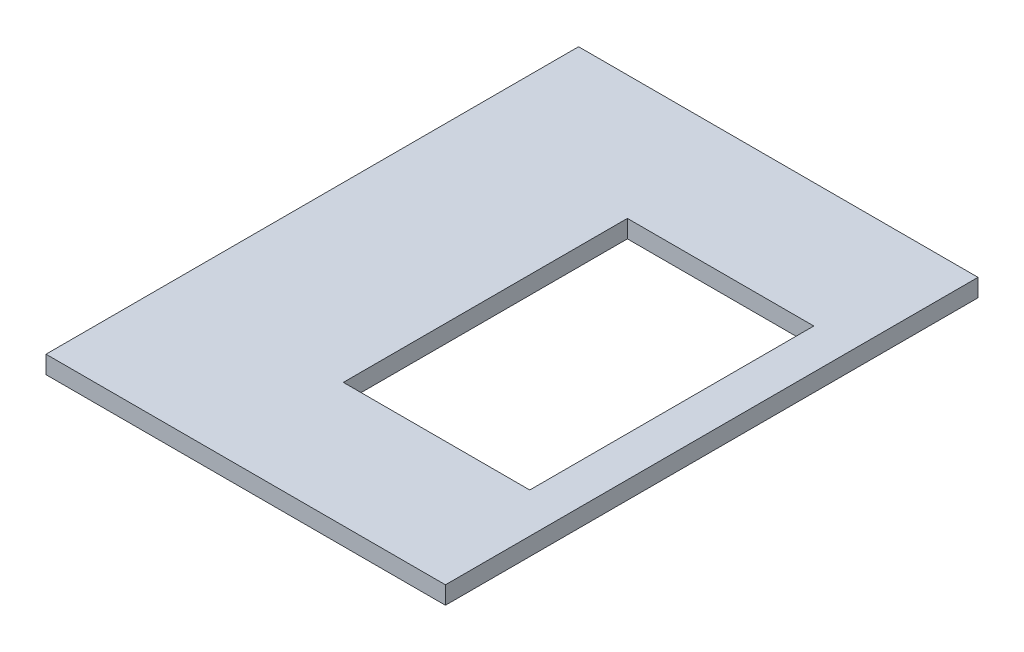
ISO-10303-21;
HEADER;
FILE_DESCRIPTION(('STEP AP214'),'2;1');
FILE_NAME('part.step','',(''),(''),'','','');
FILE_SCHEMA(('AUTOMOTIVE_DESIGN { 1 0 10303 214 1 1 1 1 }'));
ENDSEC;
DATA;
#1=APPLICATION_CONTEXT('core data for automotive mechanical design processes');
#2=APPLICATION_PROTOCOL_DEFINITION('international standard','automotive_design',2000,#1);
#3=PRODUCT_CONTEXT('',#1,'mechanical');
#4=PRODUCT('Part','Part','',(#3));
#5=PRODUCT_RELATED_PRODUCT_CATEGORY('part','',(#4));
#6=PRODUCT_DEFINITION_FORMATION('','',#4);
#7=PRODUCT_DEFINITION_CONTEXT('part definition',#1,'design');
#8=PRODUCT_DEFINITION('design','',#6,#7);
#9=PRODUCT_DEFINITION_SHAPE('','',#8);
#10=(LENGTH_UNIT() NAMED_UNIT(*) SI_UNIT(.MILLI.,.METRE.));
#11=(NAMED_UNIT(*) PLANE_ANGLE_UNIT() SI_UNIT($,.RADIAN.));
#12=(NAMED_UNIT(*) SI_UNIT($,.STERADIAN.) SOLID_ANGLE_UNIT());
#13=UNCERTAINTY_MEASURE_WITH_UNIT(LENGTH_MEASURE(1.E-05),#10,'distance_accuracy_value','');
#14=(GEOMETRIC_REPRESENTATION_CONTEXT(3) GLOBAL_UNCERTAINTY_ASSIGNED_CONTEXT((#13)) GLOBAL_UNIT_ASSIGNED_CONTEXT((#10,
#11,#12)) REPRESENTATION_CONTEXT('',''));
#15=CARTESIAN_POINT('',(0.,0.,0.));
#16=DIRECTION('',(0.,0.,1.));
#17=DIRECTION('',(1.,0.,0.));
#18=AXIS2_PLACEMENT_3D('',#15,#16,#17);
#19=CARTESIAN_POINT('',(22.5,2.,30.));
#20=DIRECTION('',(-1.,0.,0.));
#21=DIRECTION('',(0.,0.,1.));
#22=AXIS2_PLACEMENT_3D('',#19,#20,#21);
#23=PLANE('',#22);
#24=DIRECTION('',(0.,0.,-1.));
#25=VECTOR('',#24,1.);
#26=CARTESIAN_POINT('',(22.5,0.,30.));
#27=LINE('',#26,#25);
#28=CARTESIAN_POINT('',(22.5,0.,30.));
#29=VERTEX_POINT('',#28);
#30=CARTESIAN_POINT('',(22.5,0.,-30.));
#31=VERTEX_POINT('',#30);
#32=EDGE_CURVE('E130',#29,#31,#27,.T.);
#33=ORIENTED_EDGE('',*,*,#32,.T.);
#34=DIRECTION('',(0.,-1.,0.));
#35=VECTOR('',#34,1.);
#36=CARTESIAN_POINT('',(22.5,2.,-30.));
#37=LINE('',#36,#35);
#38=CARTESIAN_POINT('',(22.5,2.,-30.));
#39=VERTEX_POINT('',#38);
#40=EDGE_CURVE('E11',#39,#31,#37,.T.);
#41=ORIENTED_EDGE('',*,*,#40,.F.);
#42=DIRECTION('',(0.,0.,-1.));
#43=VECTOR('',#42,1.);
#44=CARTESIAN_POINT('',(22.5,2.,30.));
#45=LINE('',#44,#43);
#46=CARTESIAN_POINT('',(22.5,2.,30.));
#47=VERTEX_POINT('',#46);
#48=EDGE_CURVE('E134',#47,#39,#45,.T.);
#49=ORIENTED_EDGE('',*,*,#48,.F.);
#50=DIRECTION('',(0.,-1.,0.));
#51=VECTOR('',#50,1.);
#52=CARTESIAN_POINT('',(22.5,2.,30.));
#53=LINE('',#52,#51);
#54=EDGE_CURVE('E144',#47,#29,#53,.T.);
#55=ORIENTED_EDGE('',*,*,#54,.T.);
#56=EDGE_LOOP('',(#33,#41,#49,#55));
#57=FACE_BOUND('',#56,.T.);
#58=ADVANCED_FACE('F33',(#57),#23,.F.);
#59=CARTESIAN_POINT('',(-22.5,2.,-30.));
#60=DIRECTION('',(0.,0.,1.));
#61=DIRECTION('',(1.,0.,0.));
#62=AXIS2_PLACEMENT_3D('',#59,#60,#61);
#63=PLANE('',#62);
#64=DIRECTION('',(-1.,0.,0.));
#65=VECTOR('',#64,1.);
#66=CARTESIAN_POINT('',(-22.5,0.,-30.));
#67=LINE('',#66,#65);
#68=CARTESIAN_POINT('',(-22.5,0.,-30.));
#69=VERTEX_POINT('',#68);
#70=EDGE_CURVE('E147',#31,#69,#67,.T.);
#71=ORIENTED_EDGE('',*,*,#70,.T.);
#72=DIRECTION('',(0.,-1.,0.));
#73=VECTOR('',#72,1.);
#74=CARTESIAN_POINT('',(-22.5,2.,-30.));
#75=LINE('',#74,#73);
#76=CARTESIAN_POINT('',(-22.5,2.,-30.));
#77=VERTEX_POINT('',#76);
#78=EDGE_CURVE('E40',#77,#69,#75,.T.);
#79=ORIENTED_EDGE('',*,*,#78,.F.);
#80=DIRECTION('',(-1.,0.,0.));
#81=VECTOR('',#80,1.);
#82=CARTESIAN_POINT('',(-22.5,2.,-30.));
#83=LINE('',#82,#81);
#84=EDGE_CURVE('E137',#39,#77,#83,.T.);
#85=ORIENTED_EDGE('',*,*,#84,.F.);
#86=ORIENTED_EDGE('',*,*,#40,.T.);
#87=EDGE_LOOP('',(#71,#79,#85,#86));
#88=FACE_BOUND('',#87,.T.);
#89=ADVANCED_FACE('F175',(#88),#63,.F.);
#90=CARTESIAN_POINT('',(-22.5,2.,30.));
#91=DIRECTION('',(1.,0.,0.));
#92=DIRECTION('',(0.,0.,-1.));
#93=AXIS2_PLACEMENT_3D('',#90,#91,#92);
#94=PLANE('',#93);
#95=DIRECTION('',(0.,0.,1.));
#96=VECTOR('',#95,1.);
#97=CARTESIAN_POINT('',(-22.5,0.,30.));
#98=LINE('',#97,#96);
#99=CARTESIAN_POINT('',(-22.5,0.,30.));
#100=VERTEX_POINT('',#99);
#101=EDGE_CURVE('E149',#69,#100,#98,.T.);
#102=ORIENTED_EDGE('',*,*,#101,.T.);
#103=DIRECTION('',(0.,-1.,0.));
#104=VECTOR('',#103,1.);
#105=CARTESIAN_POINT('',(-22.5,2.,30.));
#106=LINE('',#105,#104);
#107=CARTESIAN_POINT('',(-22.5,2.,30.));
#108=VERTEX_POINT('',#107);
#109=EDGE_CURVE('E154',#108,#100,#106,.T.);
#110=ORIENTED_EDGE('',*,*,#109,.F.);
#111=DIRECTION('',(0.,0.,1.));
#112=VECTOR('',#111,1.);
#113=CARTESIAN_POINT('',(-22.5,2.,30.));
#114=LINE('',#113,#112);
#115=EDGE_CURVE('E140',#77,#108,#114,.T.);
#116=ORIENTED_EDGE('',*,*,#115,.F.);
#117=ORIENTED_EDGE('',*,*,#78,.T.);
#118=EDGE_LOOP('',(#102,#110,#116,#117));
#119=FACE_BOUND('',#118,.T.);
#120=ADVANCED_FACE('F161',(#119),#94,.F.);
#121=CARTESIAN_POINT('',(-22.5,2.,30.));
#122=DIRECTION('',(0.,0.,-1.));
#123=DIRECTION('',(-1.,0.,0.));
#124=AXIS2_PLACEMENT_3D('',#121,#122,#123);
#125=PLANE('',#124);
#126=DIRECTION('',(1.,0.,0.));
#127=VECTOR('',#126,1.);
#128=CARTESIAN_POINT('',(-22.5,0.,30.));
#129=LINE('',#128,#127);
#130=EDGE_CURVE('E138',#100,#29,#129,.T.);
#131=ORIENTED_EDGE('',*,*,#130,.T.);
#132=ORIENTED_EDGE('',*,*,#54,.F.);
#133=DIRECTION('',(1.,0.,0.));
#134=VECTOR('',#133,1.);
#135=CARTESIAN_POINT('',(-22.5,2.,30.));
#136=LINE('',#135,#134);
#137=EDGE_CURVE('E142',#108,#47,#136,.T.);
#138=ORIENTED_EDGE('',*,*,#137,.F.);
#139=ORIENTED_EDGE('',*,*,#109,.T.);
#140=EDGE_LOOP('',(#131,#132,#138,#139));
#141=FACE_BOUND('',#140,.T.);
#142=ADVANCED_FACE('F168',(#141),#125,.F.);
#143=CARTESIAN_POINT('',(0.,2.,0.));
#144=DIRECTION('',(0.,-1.,0.));
#145=DIRECTION('',(0.,0.,-1.));
#146=AXIS2_PLACEMENT_3D('',#143,#144,#145);
#147=PLANE('',#146);
#148=DIRECTION('',(-1.,0.,0.));
#149=VECTOR('',#148,1.);
#150=CARTESIAN_POINT('',(-3.,2.,-16.));
#151=LINE('',#150,#149);
#152=CARTESIAN_POINT('',(18.,2.,-16.));
#153=VERTEX_POINT('',#152);
#154=CARTESIAN_POINT('',(-3.,2.,-16.));
#155=VERTEX_POINT('',#154);
#156=EDGE_CURVE('E124',#153,#155,#151,.T.);
#157=ORIENTED_EDGE('',*,*,#156,.F.);
#158=DIRECTION('',(0.,0.,-1.));
#159=VECTOR('',#158,1.);
#160=CARTESIAN_POINT('',(18.,2.,-16.));
#161=LINE('',#160,#159);
#162=CARTESIAN_POINT('',(18.,2.,16.));
#163=VERTEX_POINT('',#162);
#164=EDGE_CURVE('E47',#163,#153,#161,.T.);
#165=ORIENTED_EDGE('',*,*,#164,.F.);
#166=DIRECTION('',(1.,0.,0.));
#167=VECTOR('',#166,1.);
#168=CARTESIAN_POINT('',(-3.,2.,16.));
#169=LINE('',#168,#167);
#170=CARTESIAN_POINT('',(-3.,2.,16.));
#171=VERTEX_POINT('',#170);
#172=EDGE_CURVE('E115',#171,#163,#169,.T.);
#173=ORIENTED_EDGE('',*,*,#172,.F.);
#174=DIRECTION('',(0.,0.,1.));
#175=VECTOR('',#174,1.);
#176=CARTESIAN_POINT('',(-3.,2.,-16.));
#177=LINE('',#176,#175);
#178=EDGE_CURVE('E118',#155,#171,#177,.T.);
#179=ORIENTED_EDGE('',*,*,#178,.F.);
#180=EDGE_LOOP('',(#157,#165,#173,#179));
#181=FACE_BOUND('',#180,.T.);
#182=ORIENTED_EDGE('',*,*,#48,.T.);
#183=ORIENTED_EDGE('',*,*,#84,.T.);
#184=ORIENTED_EDGE('',*,*,#115,.T.);
#185=ORIENTED_EDGE('',*,*,#137,.T.);
#186=EDGE_LOOP('',(#182,#183,#184,#185));
#187=FACE_BOUND('',#186,.T.);
#188=ADVANCED_FACE('F174',(#181,#187),#147,.F.);
#189=CARTESIAN_POINT('',(0.,0.,0.));
#190=DIRECTION('',(0.,-1.,0.));
#191=DIRECTION('',(0.,0.,-1.));
#192=AXIS2_PLACEMENT_3D('',#189,#190,#191);
#193=PLANE('',#192);
#194=DIRECTION('',(0.,0.,-1.));
#195=VECTOR('',#194,1.);
#196=CARTESIAN_POINT('',(18.,0.,-16.));
#197=LINE('',#196,#195);
#198=CARTESIAN_POINT('',(18.,0.,16.));
#199=VERTEX_POINT('',#198);
#200=CARTESIAN_POINT('',(18.,0.,-16.));
#201=VERTEX_POINT('',#200);
#202=EDGE_CURVE('E99',#199,#201,#197,.T.);
#203=ORIENTED_EDGE('',*,*,#202,.T.);
#204=DIRECTION('',(-1.,0.,0.));
#205=VECTOR('',#204,1.);
#206=CARTESIAN_POINT('',(-3.,0.,-16.));
#207=LINE('',#206,#205);
#208=CARTESIAN_POINT('',(-3.,0.,-16.));
#209=VERTEX_POINT('',#208);
#210=EDGE_CURVE('E108',#201,#209,#207,.T.);
#211=ORIENTED_EDGE('',*,*,#210,.T.);
#212=DIRECTION('',(0.,0.,1.));
#213=VECTOR('',#212,1.);
#214=CARTESIAN_POINT('',(-3.,0.,-16.));
#215=LINE('',#214,#213);
#216=CARTESIAN_POINT('',(-3.,0.,16.));
#217=VERTEX_POINT('',#216);
#218=EDGE_CURVE('E55',#209,#217,#215,.T.);
#219=ORIENTED_EDGE('',*,*,#218,.T.);
#220=DIRECTION('',(1.,0.,0.));
#221=VECTOR('',#220,1.);
#222=CARTESIAN_POINT('',(-3.,0.,16.));
#223=LINE('',#222,#221);
#224=EDGE_CURVE('E105',#217,#199,#223,.T.);
#225=ORIENTED_EDGE('',*,*,#224,.T.);
#226=EDGE_LOOP('',(#203,#211,#219,#225));
#227=FACE_BOUND('',#226,.T.);
#228=ORIENTED_EDGE('',*,*,#32,.F.);
#229=ORIENTED_EDGE('',*,*,#130,.F.);
#230=ORIENTED_EDGE('',*,*,#101,.F.);
#231=ORIENTED_EDGE('',*,*,#70,.F.);
#232=EDGE_LOOP('',(#228,#229,#230,#231));
#233=FACE_BOUND('',#232,.T.);
#234=ADVANCED_FACE('F112',(#227,#233),#193,.T.);
#235=CARTESIAN_POINT('',(18.,0.,-16.));
#236=DIRECTION('',(1.,0.,0.));
#237=DIRECTION('',(0.,0.,-1.));
#238=AXIS2_PLACEMENT_3D('',#235,#236,#237);
#239=PLANE('',#238);
#240=ORIENTED_EDGE('',*,*,#164,.T.);
#241=DIRECTION('',(0.,1.,0.));
#242=VECTOR('',#241,1.);
#243=CARTESIAN_POINT('',(18.,0.,-16.));
#244=LINE('',#243,#242);
#245=EDGE_CURVE('E95',#201,#153,#244,.T.);
#246=ORIENTED_EDGE('',*,*,#245,.F.);
#247=ORIENTED_EDGE('',*,*,#202,.F.);
#248=DIRECTION('',(0.,1.,0.));
#249=VECTOR('',#248,1.);
#250=CARTESIAN_POINT('',(18.,0.,16.));
#251=LINE('',#250,#249);
#252=EDGE_CURVE('E128',#199,#163,#251,.T.);
#253=ORIENTED_EDGE('',*,*,#252,.T.);
#254=EDGE_LOOP('',(#240,#246,#247,#253));
#255=FACE_BOUND('',#254,.T.);
#256=ADVANCED_FACE('F97',(#255),#239,.F.);
#257=CARTESIAN_POINT('',(-3.,0.,16.));
#258=DIRECTION('',(0.,0.,1.));
#259=DIRECTION('',(1.,0.,0.));
#260=AXIS2_PLACEMENT_3D('',#257,#258,#259);
#261=PLANE('',#260);
#262=ORIENTED_EDGE('',*,*,#172,.T.);
#263=ORIENTED_EDGE('',*,*,#252,.F.);
#264=ORIENTED_EDGE('',*,*,#224,.F.);
#265=DIRECTION('',(0.,1.,0.));
#266=VECTOR('',#265,1.);
#267=CARTESIAN_POINT('',(-3.,0.,16.));
#268=LINE('',#267,#266);
#269=EDGE_CURVE('E131',#217,#171,#268,.T.);
#270=ORIENTED_EDGE('',*,*,#269,.T.);
#271=EDGE_LOOP('',(#262,#263,#264,#270));
#272=FACE_BOUND('',#271,.T.);
#273=ADVANCED_FACE('F192',(#272),#261,.F.);
#274=CARTESIAN_POINT('',(-3.,0.,-16.));
#275=DIRECTION('',(-1.,0.,0.));
#276=DIRECTION('',(0.,0.,1.));
#277=AXIS2_PLACEMENT_3D('',#274,#275,#276);
#278=PLANE('',#277);
#279=ORIENTED_EDGE('',*,*,#178,.T.);
#280=ORIENTED_EDGE('',*,*,#269,.F.);
#281=ORIENTED_EDGE('',*,*,#218,.F.);
#282=DIRECTION('',(0.,1.,0.));
#283=VECTOR('',#282,1.);
#284=CARTESIAN_POINT('',(-3.,0.,-16.));
#285=LINE('',#284,#283);
#286=EDGE_CURVE('E104',#209,#155,#285,.T.);
#287=ORIENTED_EDGE('',*,*,#286,.T.);
#288=EDGE_LOOP('',(#279,#280,#281,#287));
#289=FACE_BOUND('',#288,.T.);
#290=ADVANCED_FACE('F195',(#289),#278,.F.);
#291=CARTESIAN_POINT('',(-3.,0.,-16.));
#292=DIRECTION('',(0.,0.,-1.));
#293=DIRECTION('',(-1.,0.,0.));
#294=AXIS2_PLACEMENT_3D('',#291,#292,#293);
#295=PLANE('',#294);
#296=ORIENTED_EDGE('',*,*,#156,.T.);
#297=ORIENTED_EDGE('',*,*,#286,.F.);
#298=ORIENTED_EDGE('',*,*,#210,.F.);
#299=ORIENTED_EDGE('',*,*,#245,.T.);
#300=EDGE_LOOP('',(#296,#297,#298,#299));
#301=FACE_BOUND('',#300,.T.);
#302=ADVANCED_FACE('F109',(#301),#295,.F.);
#303=CLOSED_SHELL('',(#58,#89,#120,#142,#188,#234,#256,#273,#290,#302));
#304=MANIFOLD_SOLID_BREP('B2',#303);
#305=ADVANCED_BREP_SHAPE_REPRESENTATION('',(#18,#304),#14);
#306=SHAPE_DEFINITION_REPRESENTATION(#9,#305);
ENDSEC;
END-ISO-10303-21;
